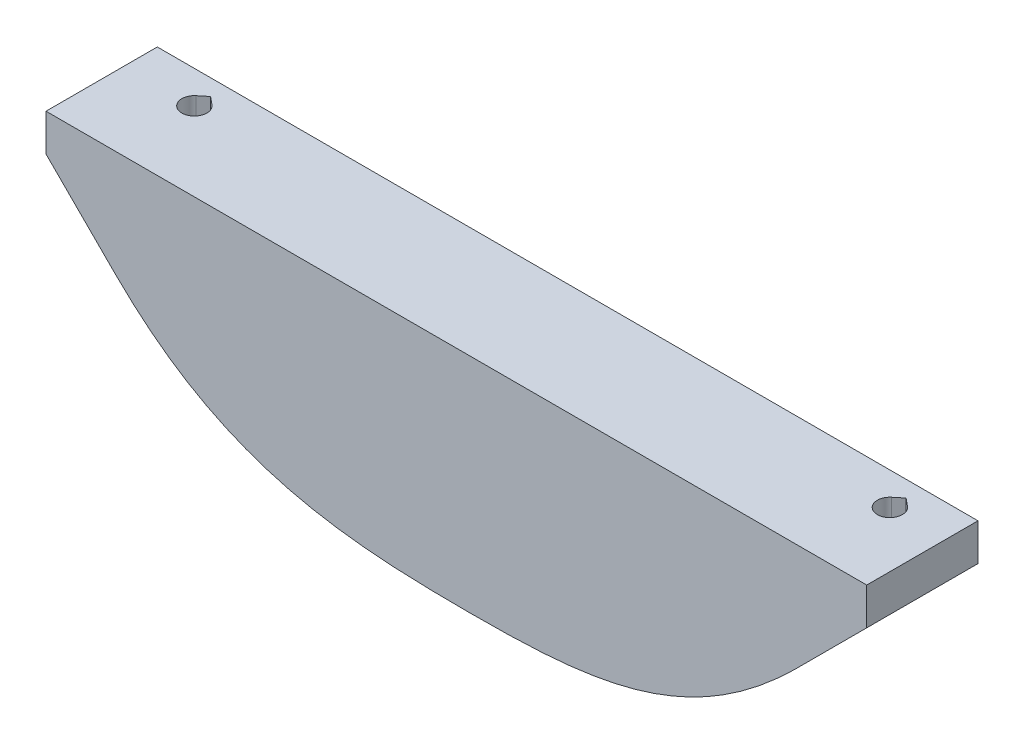
ISO-10303-21;
HEADER;
FILE_DESCRIPTION(('STEP AP214'),'2;1');
FILE_NAME('part.step','',(''),(''),'','','');
FILE_SCHEMA(('AUTOMOTIVE_DESIGN { 1 0 10303 214 1 1 1 1 }'));
ENDSEC;
DATA;
#1=APPLICATION_CONTEXT('core data for automotive mechanical design processes');
#2=APPLICATION_PROTOCOL_DEFINITION('international standard','automotive_design',2000,#1);
#3=PRODUCT_CONTEXT('',#1,'mechanical');
#4=PRODUCT('Part','Part','',(#3));
#5=PRODUCT_RELATED_PRODUCT_CATEGORY('part','',(#4));
#6=PRODUCT_DEFINITION_FORMATION('','',#4);
#7=PRODUCT_DEFINITION_CONTEXT('part definition',#1,'design');
#8=PRODUCT_DEFINITION('design','',#6,#7);
#9=PRODUCT_DEFINITION_SHAPE('','',#8);
#10=(LENGTH_UNIT() NAMED_UNIT(*) SI_UNIT(.MILLI.,.METRE.));
#11=(NAMED_UNIT(*) PLANE_ANGLE_UNIT() SI_UNIT($,.RADIAN.));
#12=(NAMED_UNIT(*) SI_UNIT($,.STERADIAN.) SOLID_ANGLE_UNIT());
#13=UNCERTAINTY_MEASURE_WITH_UNIT(LENGTH_MEASURE(1.E-05),#10,'distance_accuracy_value','');
#14=(GEOMETRIC_REPRESENTATION_CONTEXT(3) GLOBAL_UNCERTAINTY_ASSIGNED_CONTEXT((#13)) GLOBAL_UNIT_ASSIGNED_CONTEXT((#10,
#11,#12)) REPRESENTATION_CONTEXT('',''));
#15=CARTESIAN_POINT('',(0.,0.,0.));
#16=DIRECTION('',(0.,0.,1.));
#17=DIRECTION('',(1.,0.,0.));
#18=AXIS2_PLACEMENT_3D('',#15,#16,#17);
#19=CARTESIAN_POINT('',(82.5,-64.,-8.5));
#20=DIRECTION('',(0.,1.,0.));
#21=DIRECTION('',(0.,0.,1.));
#22=AXIS2_PLACEMENT_3D('',#19,#20,#21);
#23=CYLINDRICAL_SURFACE('',#22,1.35000000000001);
#24=DIRECTION('',(0.,1.,0.));
#25=VECTOR('',#24,1.);
#26=CARTESIAN_POINT('',(81.6409734983062,-64.,-9.54142857142858));
#27=LINE('',#26,#25);
#28=CARTESIAN_POINT('',(81.6409734983062,-43.,-9.54142857142858));
#29=VERTEX_POINT('',#28);
#30=CARTESIAN_POINT('',(81.6409734983062,-40.,-9.54142857142858));
#31=VERTEX_POINT('',#30);
#32=EDGE_CURVE('E152',#29,#31,#27,.T.);
#33=ORIENTED_EDGE('',*,*,#32,.T.);
#34=CARTESIAN_POINT('',(82.5,-40.,-8.5));
#35=DIRECTION('',(0.,1.,0.));
#36=DIRECTION('',(0.,0.,1.));
#37=AXIS2_PLACEMENT_3D('',#34,#35,#36);
#38=CIRCLE('',#37,1.35000000000001);
#39=CARTESIAN_POINT('',(83.3590265016938,-40.,-9.54142857142858));
#40=VERTEX_POINT('',#39);
#41=EDGE_CURVE('E162',#31,#40,#38,.T.);
#42=ORIENTED_EDGE('',*,*,#41,.T.);
#43=DIRECTION('',(0.,1.,0.));
#44=VECTOR('',#43,1.);
#45=CARTESIAN_POINT('',(83.3590265016938,-64.,-9.54142857142858));
#46=LINE('',#45,#44);
#47=CARTESIAN_POINT('',(83.3590265016938,-43.,-9.54142857142858));
#48=VERTEX_POINT('',#47);
#49=EDGE_CURVE('E165',#48,#40,#46,.T.);
#50=ORIENTED_EDGE('',*,*,#49,.F.);
#51=CARTESIAN_POINT('',(82.5,-43.,-8.5));
#52=DIRECTION('',(0.,1.,0.));
#53=DIRECTION('',(0.,0.,1.));
#54=AXIS2_PLACEMENT_3D('',#51,#52,#53);
#55=CIRCLE('',#54,1.35000000000001);
#56=EDGE_CURVE('E164',#48,#29,#55,.F.);
#57=ORIENTED_EDGE('',*,*,#56,.T.);
#58=EDGE_LOOP('',(#33,#42,#50,#57));
#59=FACE_BOUND('',#58,.T.);
#60=ADVANCED_FACE('F43',(#59),#23,.F.);
#61=CARTESIAN_POINT('',(7.5,-64.,-8.5));
#62=DIRECTION('',(0.,1.,0.));
#63=DIRECTION('',(0.,0.,1.));
#64=AXIS2_PLACEMENT_3D('',#61,#62,#63);
#65=CYLINDRICAL_SURFACE('',#64,1.35);
#66=DIRECTION('',(0.,1.,0.));
#67=VECTOR('',#66,1.);
#68=CARTESIAN_POINT('',(6.64097349830623,-64.,-9.54142857142858));
#69=LINE('',#68,#67);
#70=CARTESIAN_POINT('',(6.64097349830623,-43.,-9.54142857142858));
#71=VERTEX_POINT('',#70);
#72=CARTESIAN_POINT('',(6.64097349830623,-40.,-9.54142857142858));
#73=VERTEX_POINT('',#72);
#74=EDGE_CURVE('E273',#71,#73,#69,.T.);
#75=ORIENTED_EDGE('',*,*,#74,.T.);
#76=CARTESIAN_POINT('',(7.5,-40.,-8.5));
#77=DIRECTION('',(0.,1.,0.));
#78=DIRECTION('',(0.,0.,1.));
#79=AXIS2_PLACEMENT_3D('',#76,#77,#78);
#80=CIRCLE('',#79,1.35);
#81=CARTESIAN_POINT('',(8.35902650169377,-40.,-9.54142857142857));
#82=VERTEX_POINT('',#81);
#83=EDGE_CURVE('E168',#73,#82,#80,.T.);
#84=ORIENTED_EDGE('',*,*,#83,.T.);
#85=DIRECTION('',(0.,1.,0.));
#86=VECTOR('',#85,1.);
#87=CARTESIAN_POINT('',(8.35902650169377,-64.,-9.54142857142857));
#88=LINE('',#87,#86);
#89=CARTESIAN_POINT('',(8.35902650169377,-43.,-9.54142857142857));
#90=VERTEX_POINT('',#89);
#91=EDGE_CURVE('E275',#90,#82,#88,.T.);
#92=ORIENTED_EDGE('',*,*,#91,.F.);
#93=CARTESIAN_POINT('',(7.5,-43.,-8.5));
#94=DIRECTION('',(0.,1.,0.));
#95=DIRECTION('',(0.,0.,1.));
#96=AXIS2_PLACEMENT_3D('',#93,#94,#95);
#97=CIRCLE('',#96,1.35);
#98=EDGE_CURVE('E280',#90,#71,#97,.F.);
#99=ORIENTED_EDGE('',*,*,#98,.T.);
#100=EDGE_LOOP('',(#75,#84,#92,#99));
#101=FACE_BOUND('',#100,.T.);
#102=ADVANCED_FACE('F294',(#101),#65,.F.);
#103=CARTESIAN_POINT('',(45.75,-64.,-12.));
#104=CARTESIAN_POINT('',(59.0199011969863,-64.,-12.));
#105=CARTESIAN_POINT('',(69.4421031795114,-63.0578968204885,-12.));
#106=CARTESIAN_POINT('',(81.,-51.4999999999998,-12.));
#107=B_SPLINE_CURVE_WITH_KNOTS('',3,(#103,#104,#105,#106),.UNSPECIFIED.,.F.,.F.,(4,4),(0.,1.),.UNSPECIFIED.);
#108=DIRECTION('',(0.,0.,1.));
#109=VECTOR('',#108,1.);
#110=SURFACE_OF_LINEAR_EXTRUSION('',#107,#109);
#111=DIRECTION('',(0.,0.,1.));
#112=VECTOR('',#111,1.);
#113=CARTESIAN_POINT('',(81.,-51.4999999999998,-12.));
#114=LINE('',#113,#112);
#115=CARTESIAN_POINT('',(81.,-51.4999999999998,-12.));
#116=VERTEX_POINT('',#115);
#117=CARTESIAN_POINT('',(81.,-51.4999999999998,-10.5));
#118=VERTEX_POINT('',#117);
#119=EDGE_CURVE('E326',#116,#118,#114,.T.);
#120=ORIENTED_EDGE('',*,*,#119,.T.);
#121=CARTESIAN_POINT('',(81.,-51.4999999999998,-10.5));
#122=CARTESIAN_POINT('',(80.8981381493243,-51.6019004563563,-10.4236028488812));
#123=CARTESIAN_POINT('',(80.7990052924902,-51.7002577847678,-10.3370636780068));
#124=CARTESIAN_POINT('',(80.6101749607675,-51.886433368408,-10.1423063659683));
#125=CARTESIAN_POINT('',(80.5205764294138,-51.9741422303385,-10.0338894466249));
#126=CARTESIAN_POINT('',(80.3768845782632,-52.1140246493418,-9.82450678986994));
#127=CARTESIAN_POINT('',(80.3194619907394,-52.1696472815226,-9.72817582438411));
#128=CARTESIAN_POINT('',(80.2164771831726,-52.2690655989393,-9.52397011733765));
#129=CARTESIAN_POINT('',(80.1708789814763,-52.312897179975,-9.41613184070211));
#130=CARTESIAN_POINT('',(80.1133211283983,-52.3680943966089,-9.24659156364402));
#131=CARTESIAN_POINT('',(80.0958721129863,-52.3848012724121,-9.18841718945097));
#132=CARTESIAN_POINT('',(80.0650863613742,-52.4142483485708,-9.07002514962394));
#133=CARTESIAN_POINT('',(80.0517474095305,-52.4269906861567,-9.00980860438293));
#134=CARTESIAN_POINT('',(80.0294871168373,-52.4482412008218,-8.88782507116085));
#135=CARTESIAN_POINT('',(80.0205656870604,-52.4567494631356,-8.8260581144168));
#136=CARTESIAN_POINT('',(80.0073554759728,-52.4693436044546,-8.70160848143647));
#137=CARTESIAN_POINT('',(80.0030658845351,-52.4734302568172,-8.63892596727929));
#138=CARTESIAN_POINT('',(79.9979128216856,-52.4783407169764,-8.46919224054547));
#139=CARTESIAN_POINT('',(80.0015531451674,-52.4748746341405,-8.36181398888557));
#140=CARTESIAN_POINT('',(80.0223662568896,-52.4550334219731,-8.14969663229081));
#141=CARTESIAN_POINT('',(80.0395365335569,-52.4386606885104,-8.04495704126337));
#142=CARTESIAN_POINT('',(80.0853560779265,-52.3948712080764,-7.84448416382857));
#143=CARTESIAN_POINT('',(80.1135852692799,-52.3678584415945,-7.74856432712599));
#144=CARTESIAN_POINT('',(80.179898565919,-52.3042208985521,-7.56362478250166));
#145=CARTESIAN_POINT('',(80.2179857925211,-52.2675930775573,-7.47460727166239));
#146=CARTESIAN_POINT('',(80.3192382718419,-52.1698825991026,-7.27038148472869));
#147=CARTESIAN_POINT('',(80.3863342449932,-52.1048843359905,-7.15899393299411));
#148=CARTESIAN_POINT('',(80.5322576332835,-51.9626934205865,-6.95273529717413));
#149=CARTESIAN_POINT('',(80.6111141343491,-51.8854705045487,-6.85790646516962));
#150=CARTESIAN_POINT('',(80.7427141126199,-51.7557765212964,-6.72041742350798));
#151=CARTESIAN_POINT('',(80.7928327934943,-51.7062137624676,-6.67235899311685));
#152=CARTESIAN_POINT('',(80.8950201330098,-51.6047808829769,-6.58201928439644));
#153=CARTESIAN_POINT('',(80.9470747967073,-51.5529269487418,-6.53970407838243));
#154=CARTESIAN_POINT('',(81.,-51.4999999999998,-6.5));
#155=B_SPLINE_CURVE_WITH_KNOTS('',3,(#121,#122,#123,#124,#125,#126,#127,#128,#129,#130,#131,
#132,#133,#134,#135,#136,#137,#138,#139,#140,#141,#142,#143,#144,#145,#146,#147,#148,#149,#150,
#151,#152,#153,#154),.UNSPECIFIED.,.F.,.F.,(4,2,2,2,2,2,2,2,2,2,2,2,2,2,2,2,4),(0.,
0.490223413225245,0.985119565019949,1.3592811926277,1.73229051769644,1.92101764586491,
2.1096428567287,2.29826427029663,2.48685268787951,2.80752519034097,3.12813818020169,
3.43759855421645,3.74715703173892,4.18091086759195,4.61575581312471,4.87146764475243,
5.12559619946991),.UNSPECIFIED.);
#156=CARTESIAN_POINT('',(81.,-51.4999999999998,-6.50000000000001));
#157=VERTEX_POINT('',#156);
#158=EDGE_CURVE('E247',#118,#157,#155,.T.);
#159=ORIENTED_EDGE('',*,*,#158,.T.);
#160=CARTESIAN_POINT('',(81.,-51.4999999999998,0.));
#161=VERTEX_POINT('',#160);
#162=EDGE_CURVE('E320',#157,#161,#114,.T.);
#163=ORIENTED_EDGE('',*,*,#162,.T.);
#164=CARTESIAN_POINT('',(45.75,-64.,0.));
#165=CARTESIAN_POINT('',(59.0199011969863,-64.,0.));
#166=CARTESIAN_POINT('',(69.4421031795114,-63.0578968204885,0.));
#167=CARTESIAN_POINT('',(81.,-51.4999999999998,0.));
#168=B_SPLINE_CURVE_WITH_KNOTS('',3,(#164,#165,#166,#167),.UNSPECIFIED.,.F.,.F.,(4,4),(0.,1.),.UNSPECIFIED.);
#169=CARTESIAN_POINT('',(45.75,-64.,0.));
#170=VERTEX_POINT('',#169);
#171=EDGE_CURVE('E366',#170,#161,#168,.T.);
#172=ORIENTED_EDGE('',*,*,#171,.F.);
#173=DIRECTION('',(0.,0.,1.));
#174=VECTOR('',#173,1.);
#175=CARTESIAN_POINT('',(45.75,-64.,-12.));
#176=LINE('',#175,#174);
#177=CARTESIAN_POINT('',(45.75,-64.,-12.));
#178=VERTEX_POINT('',#177);
#179=EDGE_CURVE('E327',#178,#170,#176,.T.);
#180=ORIENTED_EDGE('',*,*,#179,.F.);
#181=EDGE_CURVE('E196',#178,#116,#107,.T.);
#182=ORIENTED_EDGE('',*,*,#181,.T.);
#183=EDGE_LOOP('',(#120,#159,#163,#172,#180,#182));
#184=FACE_BOUND('',#183,.T.);
#185=ADVANCED_FACE('F210',(#184),#110,.T.);
#186=CARTESIAN_POINT('',(7.5,-51.4999999999999,-12.));
#187=CARTESIAN_POINT('',(19.0731812469173,-63.073181246917,-12.));
#188=CARTESIAN_POINT('',(31.7289344991981,-64.,-12.));
#189=CARTESIAN_POINT('',(45.75,-64.,-12.));
#190=B_SPLINE_CURVE_WITH_KNOTS('',3,(#186,#187,#188,#189),.UNSPECIFIED.,.F.,.F.,(4,4),(0.,1.),.UNSPECIFIED.);
#191=DIRECTION('',(0.,0.,1.));
#192=VECTOR('',#191,1.);
#193=SURFACE_OF_LINEAR_EXTRUSION('',#190,#192);
#194=DIRECTION('',(0.,0.,1.));
#195=VECTOR('',#194,1.);
#196=CARTESIAN_POINT('',(7.5,-51.4999999999999,-12.));
#197=LINE('',#196,#195);
#198=CARTESIAN_POINT('',(7.5,-51.4999999999999,-6.));
#199=VERTEX_POINT('',#198);
#200=CARTESIAN_POINT('',(7.5,-51.4999999999999,0.));
#201=VERTEX_POINT('',#200);
#202=EDGE_CURVE('E337',#199,#201,#197,.T.);
#203=ORIENTED_EDGE('',*,*,#202,.F.);
#204=CARTESIAN_POINT('',(7.5,-51.4999999999999,-6.));
#205=CARTESIAN_POINT('',(7.59165979181602,-51.5916671102849,-6.00002182225121));
#206=CARTESIAN_POINT('',(7.68371968998586,-51.6829841079566,-6.00504350850219));
#207=CARTESIAN_POINT('',(7.86814507978632,-51.8644517604298,-6.0255052724358));
#208=CARTESIAN_POINT('',(7.96051082394807,-51.9546000680645,-6.04096375156571));
#209=CARTESIAN_POINT('',(8.14565379132492,-52.1338352666923,-6.08293118887545));
#210=CARTESIAN_POINT('',(8.23842576491148,-52.2229022743857,-6.10955005685056));
#211=CARTESIAN_POINT('',(8.42247262549629,-52.3981708765312,-6.17436930999739));
#212=CARTESIAN_POINT('',(8.51374866744538,-52.4843747399536,-6.21256026923716));
#213=CARTESIAN_POINT('',(8.72766963258336,-52.6848046294476,-6.31782352965051));
#214=CARTESIAN_POINT('',(8.84922971947132,-52.7974042291345,-6.390355806112));
#215=CARTESIAN_POINT('',(9.08346479910837,-53.0121545773594,-6.56003886160259));
#216=CARTESIAN_POINT('',(9.19617064038699,-53.1143420091395,-6.65709869911205));
#217=CARTESIAN_POINT('',(9.38494271816455,-53.2839513160765,-6.85338778490265));
#218=CARTESIAN_POINT('',(9.46367450734276,-53.3541225148192,-6.9476561021416));
#219=CARTESIAN_POINT('',(9.60919932986215,-53.4830266873409,-7.15205102012642));
#220=CARTESIAN_POINT('',(9.67600182541446,-53.541768729968,-7.26216492595975));
#221=CARTESIAN_POINT('',(9.78362097902614,-53.6359535687267,-7.47680356279181));
#222=CARTESIAN_POINT('',(9.82692640456064,-53.6736613908218,-7.57907873809508));
#223=CARTESIAN_POINT('',(9.90022008612338,-53.7373027470303,-7.79178465511006));
#224=CARTESIAN_POINT('',(9.93021578995894,-53.7632428662559,-7.90221079527945));
#225=CARTESIAN_POINT('',(9.97502766360576,-53.8019423110304,-8.12898225572133));
#226=CARTESIAN_POINT('',(9.98976717426313,-53.8146350740439,-8.24535441484623));
#227=CARTESIAN_POINT('',(10.0026669845284,-53.8257456745836,-8.47968890223724));
#228=CARTESIAN_POINT('',(10.0008318675444,-53.8241674584863,-8.59765078188641));
#229=CARTESIAN_POINT('',(9.98160929384268,-53.8076053023677,-8.82112744912902));
#230=CARTESIAN_POINT('',(9.9655558305262,-53.7937712049316,-8.92684854644908));
#231=CARTESIAN_POINT('',(9.92073453427701,-53.7550417199852,-9.13341862335747));
#232=CARTESIAN_POINT('',(9.89196593496071,-53.7301456657335,-9.23426730886281));
#233=CARTESIAN_POINT('',(9.82204958418611,-53.6694145605798,-9.43248765067607));
#234=CARTESIAN_POINT('',(9.78049107706031,-53.6332158500589,-9.52960093690972));
#235=CARTESIAN_POINT('',(9.68745469339733,-53.5517904220451,-9.71482785778287));
#236=CARTESIAN_POINT('',(9.63597150330262,-53.5065588680067,-9.80293663267413));
#237=CARTESIAN_POINT('',(9.50077535721237,-53.3871211916968,-10.0058406296931));
#238=CARTESIAN_POINT('',(9.41281413901743,-53.3088946899752,-10.1154542498754));
#239=CARTESIAN_POINT('',(9.22554659885682,-53.1408180812689,-10.3141713016641));
#240=CARTESIAN_POINT('',(9.1262178303413,-53.0509449286674,-10.4032330682516));
#241=CARTESIAN_POINT('',(8.88577542750525,-52.8312466212013,-10.5879794980886));
#242=CARTESIAN_POINT('',(8.74178370017899,-52.6981012060703,-10.6759465775363));
#243=CARTESIAN_POINT('',(8.44719665427424,-52.4219421914781,-10.8194249503099));
#244=CARTESIAN_POINT('',(8.29659058060572,-52.2789122853994,-10.8748811085109));
#245=CARTESIAN_POINT('',(8.03747498084326,-52.0294318550485,-10.9440760809821));
#246=CARTESIAN_POINT('',(7.92945489589852,-51.9244343697561,-10.9652556628468));
#247=CARTESIAN_POINT('',(7.71411223883786,-51.7131133013675,-10.9931536053829));
#248=CARTESIAN_POINT('',(7.6067893816706,-51.6068015034584,-10.9999582381972));
#249=CARTESIAN_POINT('',(7.5,-51.4999999999999,-11.));
#250=B_SPLINE_CURVE_WITH_KNOTS('',3,(#204,#205,#206,#207,#208,#209,#210,#211,#212,#213,#214,
#215,#216,#217,#218,#219,#220,#221,#222,#223,#224,#225,#226,#227,#228,#229,#230,#231,#232,#233,
#234,#235,#236,#237,#238,#239,#240,#241,#242,#243,#244,#245,#246,#247,#248,#249),.UNSPECIFIED.,
.F.,.F.,(4,2,2,2,2,2,2,2,2,2,2,2,2,2,2,2,2,2,2,2,2,2,4),(0.,0.388850136486089,0.778387663858417,
1.17185505391982,1.56500280667377,2.10571307963264,2.64444723000454,3.06725643511144,
3.48972876744308,3.84015012207303,4.19037514110135,4.54235154747597,4.89423062423619,
5.2162269112512,5.53824260870188,5.871925592382,6.205787724638,6.68566387560185,7.1665045018113,
7.80789365536139,8.45036741462438,8.90607805302852,9.35904585397621),.UNSPECIFIED.);
#251=CARTESIAN_POINT('',(7.5,-51.4999999999999,-11.));
#252=VERTEX_POINT('',#251);
#253=EDGE_CURVE('E175',#199,#252,#250,.T.);
#254=ORIENTED_EDGE('',*,*,#253,.T.);
#255=CARTESIAN_POINT('',(7.5,-51.4999999999999,-12.));
#256=VERTEX_POINT('',#255);
#257=EDGE_CURVE('E330',#256,#252,#197,.T.);
#258=ORIENTED_EDGE('',*,*,#257,.F.);
#259=EDGE_CURVE('E190',#256,#178,#190,.T.);
#260=ORIENTED_EDGE('',*,*,#259,.T.);
#261=ORIENTED_EDGE('',*,*,#179,.T.);
#262=CARTESIAN_POINT('',(7.5,-51.4999999999999,0.));
#263=CARTESIAN_POINT('',(19.0731812469173,-63.073181246917,0.));
#264=CARTESIAN_POINT('',(31.7289344991981,-64.,0.));
#265=CARTESIAN_POINT('',(45.75,-64.,0.));
#266=B_SPLINE_CURVE_WITH_KNOTS('',3,(#262,#263,#264,#265),.UNSPECIFIED.,.F.,.F.,(4,4),(0.,1.),.UNSPECIFIED.);
#267=EDGE_CURVE('E361',#201,#170,#266,.T.);
#268=ORIENTED_EDGE('',*,*,#267,.F.);
#269=EDGE_LOOP('',(#203,#254,#258,#260,#261,#268));
#270=FACE_BOUND('',#269,.T.);
#271=ADVANCED_FACE('F205',(#270),#193,.T.);
#272=CARTESIAN_POINT('',(88.5,-40.,-12.));
#273=DIRECTION('',(1.,0.,0.));
#274=DIRECTION('',(0.,0.,-1.));
#275=AXIS2_PLACEMENT_3D('',#272,#273,#274);
#276=PLANE('',#275);
#277=DIRECTION('',(0.,1.,0.));
#278=VECTOR('',#277,1.);
#279=CARTESIAN_POINT('',(88.5,-40.,0.));
#280=LINE('',#279,#278);
#281=CARTESIAN_POINT('',(88.5,-44.,0.));
#282=VERTEX_POINT('',#281);
#283=CARTESIAN_POINT('',(88.5,-40.,0.));
#284=VERTEX_POINT('',#283);
#285=EDGE_CURVE('E172',#282,#284,#280,.T.);
#286=ORIENTED_EDGE('',*,*,#285,.F.);
#287=DIRECTION('',(0.,0.,1.));
#288=VECTOR('',#287,1.);
#289=CARTESIAN_POINT('',(88.5,-44.,-12.));
#290=LINE('',#289,#288);
#291=CARTESIAN_POINT('',(88.5,-44.,-12.));
#292=VERTEX_POINT('',#291);
#293=EDGE_CURVE('E329',#292,#282,#290,.T.);
#294=ORIENTED_EDGE('',*,*,#293,.F.);
#295=DIRECTION('',(0.,1.,0.));
#296=VECTOR('',#295,1.);
#297=CARTESIAN_POINT('',(88.5,-40.,-12.));
#298=LINE('',#297,#296);
#299=CARTESIAN_POINT('',(88.5,-40.,-12.));
#300=VERTEX_POINT('',#299);
#301=EDGE_CURVE('E178',#292,#300,#298,.T.);
#302=ORIENTED_EDGE('',*,*,#301,.T.);
#303=DIRECTION('',(0.,0.,1.));
#304=VECTOR('',#303,1.);
#305=CARTESIAN_POINT('',(88.5,-40.,-12.));
#306=LINE('',#305,#304);
#307=EDGE_CURVE('E342',#300,#284,#306,.T.);
#308=ORIENTED_EDGE('',*,*,#307,.T.);
#309=EDGE_LOOP('',(#286,#294,#302,#308));
#310=FACE_BOUND('',#309,.T.);
#311=ADVANCED_FACE('F45',(#310),#276,.T.);
#312=CARTESIAN_POINT('',(88.5,-44.,-12.));
#313=DIRECTION('',(0.707106781186541,-0.707106781186554,0.));
#314=DIRECTION('',(0.707106781186554,0.707106781186541,0.));
#315=AXIS2_PLACEMENT_3D('',#312,#313,#314);
#316=PLANE('',#315);
#317=ORIENTED_EDGE('',*,*,#162,.F.);
#318=CARTESIAN_POINT('',(82.5,-49.9999999999998,-8.5));
#319=DIRECTION('',(0.707106781186541,-0.707106781186554,0.));
#320=DIRECTION('',(-0.707106781186554,-0.707106781186541,0.));
#321=AXIS2_PLACEMENT_3D('',#318,#319,#320);
#322=ELLIPSE('',#321,3.5355339059327,2.5);
#323=EDGE_CURVE('E169',#157,#118,#322,.F.);
#324=ORIENTED_EDGE('',*,*,#323,.T.);
#325=ORIENTED_EDGE('',*,*,#119,.F.);
#326=DIRECTION('',(0.707106781186554,0.707106781186541,0.));
#327=VECTOR('',#326,1.);
#328=CARTESIAN_POINT('',(88.5,-44.,-12.));
#329=LINE('',#328,#327);
#330=EDGE_CURVE('E344',#116,#292,#329,.T.);
#331=ORIENTED_EDGE('',*,*,#330,.T.);
#332=ORIENTED_EDGE('',*,*,#293,.T.);
#333=DIRECTION('',(0.707106781186554,0.707106781186541,0.));
#334=VECTOR('',#333,1.);
#335=CARTESIAN_POINT('',(88.5,-44.,0.));
#336=LINE('',#335,#334);
#337=EDGE_CURVE('E182',#161,#282,#336,.T.);
#338=ORIENTED_EDGE('',*,*,#337,.F.);
#339=EDGE_LOOP('',(#317,#324,#325,#331,#332,#338));
#340=FACE_BOUND('',#339,.T.);
#341=ADVANCED_FACE('F308',(#340),#316,.T.);
#342=CARTESIAN_POINT('',(0.,-44.,-12.));
#343=DIRECTION('',(-0.707106781186543,-0.707106781186552,0.));
#344=DIRECTION('',(0.707106781186552,-0.707106781186543,0.));
#345=AXIS2_PLACEMENT_3D('',#342,#343,#344);
#346=PLANE('',#345);
#347=ORIENTED_EDGE('',*,*,#257,.T.);
#348=CARTESIAN_POINT('',(7.5,-51.4999999999999,-8.5));
#349=DIRECTION('',(-0.707106781186543,-0.707106781186552,0.));
#350=DIRECTION('',(0.707106781186552,-0.707106781186543,0.));
#351=AXIS2_PLACEMENT_3D('',#348,#349,#350);
#352=ELLIPSE('',#351,3.53553390593272,2.5);
#353=EDGE_CURVE('E256',#252,#199,#352,.F.);
#354=ORIENTED_EDGE('',*,*,#353,.T.);
#355=ORIENTED_EDGE('',*,*,#202,.T.);
#356=DIRECTION('',(0.707106781186551,-0.707106781186543,0.));
#357=VECTOR('',#356,1.);
#358=CARTESIAN_POINT('',(0.,-44.,0.));
#359=LINE('',#358,#357);
#360=CARTESIAN_POINT('',(0.,-44.,0.));
#361=VERTEX_POINT('',#360);
#362=EDGE_CURVE('E358',#361,#201,#359,.T.);
#363=ORIENTED_EDGE('',*,*,#362,.F.);
#364=DIRECTION('',(0.,0.,1.));
#365=VECTOR('',#364,1.);
#366=CARTESIAN_POINT('',(0.,-44.,-12.));
#367=LINE('',#366,#365);
#368=CARTESIAN_POINT('',(0.,-44.,-12.));
#369=VERTEX_POINT('',#368);
#370=EDGE_CURVE('E338',#369,#361,#367,.T.);
#371=ORIENTED_EDGE('',*,*,#370,.F.);
#372=DIRECTION('',(0.707106781186551,-0.707106781186543,0.));
#373=VECTOR('',#372,1.);
#374=CARTESIAN_POINT('',(0.,-44.,-12.));
#375=LINE('',#374,#373);
#376=EDGE_CURVE('E187',#369,#256,#375,.T.);
#377=ORIENTED_EDGE('',*,*,#376,.T.);
#378=EDGE_LOOP('',(#347,#354,#355,#363,#371,#377));
#379=FACE_BOUND('',#378,.T.);
#380=ADVANCED_FACE('F214',(#379),#346,.T.);
#381=CARTESIAN_POINT('',(0.,-40.,-12.));
#382=DIRECTION('',(-1.,0.,0.));
#383=DIRECTION('',(0.,-1.,0.));
#384=AXIS2_PLACEMENT_3D('',#381,#382,#383);
#385=PLANE('',#384);
#386=DIRECTION('',(0.,-1.,0.));
#387=VECTOR('',#386,1.);
#388=CARTESIAN_POINT('',(0.,-40.,0.));
#389=LINE('',#388,#387);
#390=CARTESIAN_POINT('',(0.,-40.,0.));
#391=VERTEX_POINT('',#390);
#392=EDGE_CURVE('E355',#391,#361,#389,.T.);
#393=ORIENTED_EDGE('',*,*,#392,.F.);
#394=DIRECTION('',(0.,0.,1.));
#395=VECTOR('',#394,1.);
#396=CARTESIAN_POINT('',(0.,-40.,-12.));
#397=LINE('',#396,#395);
#398=CARTESIAN_POINT('',(0.,-40.,-12.));
#399=VERTEX_POINT('',#398);
#400=EDGE_CURVE('E340',#399,#391,#397,.T.);
#401=ORIENTED_EDGE('',*,*,#400,.F.);
#402=DIRECTION('',(0.,-1.,0.));
#403=VECTOR('',#402,1.);
#404=CARTESIAN_POINT('',(0.,-40.,-12.));
#405=LINE('',#404,#403);
#406=EDGE_CURVE('E184',#399,#369,#405,.T.);
#407=ORIENTED_EDGE('',*,*,#406,.T.);
#408=ORIENTED_EDGE('',*,*,#370,.T.);
#409=EDGE_LOOP('',(#393,#401,#407,#408));
#410=FACE_BOUND('',#409,.T.);
#411=ADVANCED_FACE('F314',(#410),#385,.T.);
#412=CARTESIAN_POINT('',(15.,-40.,-12.));
#413=DIRECTION('',(0.,1.,0.));
#414=DIRECTION('',(0.,0.,1.));
#415=AXIS2_PLACEMENT_3D('',#412,#413,#414);
#416=PLANE('',#415);
#417=DIRECTION('',(-0.771428571428573,0.,0.636315927180573));
#418=VECTOR('',#417,1.);
#419=CARTESIAN_POINT('',(7.5,-40.,-10.25));
#420=LINE('',#419,#418);
#421=CARTESIAN_POINT('',(7.5,-40.,-10.25));
#422=VERTEX_POINT('',#421);
#423=EDGE_CURVE('E266',#422,#73,#420,.T.);
#424=ORIENTED_EDGE('',*,*,#423,.F.);
#425=DIRECTION('',(-0.771428571428571,0.,-0.636315927180574));
#426=VECTOR('',#425,1.);
#427=CARTESIAN_POINT('',(7.5,-40.,-10.25));
#428=LINE('',#427,#426);
#429=EDGE_CURVE('E271',#82,#422,#428,.T.);
#430=ORIENTED_EDGE('',*,*,#429,.F.);
#431=ORIENTED_EDGE('',*,*,#83,.F.);
#432=EDGE_LOOP('',(#424,#430,#431));
#433=FACE_BOUND('',#432,.T.);
#434=DIRECTION('',(-1.,0.,0.));
#435=VECTOR('',#434,1.);
#436=CARTESIAN_POINT('',(15.,-40.,0.));
#437=LINE('',#436,#435);
#438=EDGE_CURVE('E352',#284,#391,#437,.T.);
#439=ORIENTED_EDGE('',*,*,#438,.F.);
#440=ORIENTED_EDGE('',*,*,#307,.F.);
#441=DIRECTION('',(-1.,0.,0.));
#442=VECTOR('',#441,1.);
#443=CARTESIAN_POINT('',(88.5,-40.,-12.));
#444=LINE('',#443,#442);
#445=EDGE_CURVE('E181',#300,#399,#444,.T.);
#446=ORIENTED_EDGE('',*,*,#445,.T.);
#447=ORIENTED_EDGE('',*,*,#400,.T.);
#448=EDGE_LOOP('',(#439,#440,#446,#447));
#449=FACE_BOUND('',#448,.T.);
#450=DIRECTION('',(-0.771428571428574,0.,0.63631592718057));
#451=VECTOR('',#450,1.);
#452=CARTESIAN_POINT('',(82.5,-40.,-10.25));
#453=LINE('',#452,#451);
#454=CARTESIAN_POINT('',(82.5,-40.,-10.25));
#455=VERTEX_POINT('',#454);
#456=EDGE_CURVE('E149',#455,#31,#453,.T.);
#457=ORIENTED_EDGE('',*,*,#456,.F.);
#458=DIRECTION('',(-0.771428571428574,0.,-0.63631592718057));
#459=VECTOR('',#458,1.);
#460=CARTESIAN_POINT('',(82.5,-40.,-10.25));
#461=LINE('',#460,#459);
#462=EDGE_CURVE('E156',#40,#455,#461,.T.);
#463=ORIENTED_EDGE('',*,*,#462,.F.);
#464=ORIENTED_EDGE('',*,*,#41,.F.);
#465=EDGE_LOOP('',(#457,#463,#464));
#466=FACE_BOUND('',#465,.T.);
#467=ADVANCED_FACE('F167',(#433,#449,#466),#416,.T.);
#468=CARTESIAN_POINT('',(64.0170016411866,-62.0842113076831,-12.));
#469=DIRECTION('',(0.,0.,1.));
#470=DIRECTION('',(1.,0.,0.));
#471=AXIS2_PLACEMENT_3D('',#468,#469,#470);
#472=PLANE('',#471);
#473=ORIENTED_EDGE('',*,*,#301,.F.);
#474=ORIENTED_EDGE('',*,*,#330,.F.);
#475=ORIENTED_EDGE('',*,*,#181,.F.);
#476=ORIENTED_EDGE('',*,*,#259,.F.);
#477=ORIENTED_EDGE('',*,*,#376,.F.);
#478=ORIENTED_EDGE('',*,*,#406,.F.);
#479=ORIENTED_EDGE('',*,*,#445,.F.);
#480=EDGE_LOOP('',(#473,#474,#475,#476,#477,#478,#479));
#481=FACE_BOUND('',#480,.T.);
#482=ADVANCED_FACE('F302',(#481),#472,.F.);
#483=CARTESIAN_POINT('',(64.0170016411866,-62.0842113076831,0.));
#484=DIRECTION('',(0.,0.,1.));
#485=DIRECTION('',(1.,0.,0.));
#486=AXIS2_PLACEMENT_3D('',#483,#484,#485);
#487=PLANE('',#486);
#488=ORIENTED_EDGE('',*,*,#285,.T.);
#489=ORIENTED_EDGE('',*,*,#438,.T.);
#490=ORIENTED_EDGE('',*,*,#392,.T.);
#491=ORIENTED_EDGE('',*,*,#362,.T.);
#492=ORIENTED_EDGE('',*,*,#267,.T.);
#493=ORIENTED_EDGE('',*,*,#171,.T.);
#494=ORIENTED_EDGE('',*,*,#337,.T.);
#495=EDGE_LOOP('',(#488,#489,#490,#491,#492,#493,#494));
#496=FACE_BOUND('',#495,.T.);
#497=ADVANCED_FACE('F238',(#496),#487,.T.);
#498=CARTESIAN_POINT('',(15.,-43.,-12.));
#499=DIRECTION('',(0.,1.,0.));
#500=DIRECTION('',(0.,0.,1.));
#501=AXIS2_PLACEMENT_3D('',#498,#499,#500);
#502=PLANE('',#501);
#503=CARTESIAN_POINT('',(7.5,-43.,-8.5));
#504=DIRECTION('',(0.,1.,0.));
#505=DIRECTION('',(0.,0.,1.));
#506=AXIS2_PLACEMENT_3D('',#503,#504,#505);
#507=CIRCLE('',#506,2.5);
#508=CARTESIAN_POINT('',(7.5,-43.,-6.));
#509=VERTEX_POINT('',#508);
#510=EDGE_CURVE('E278',#509,#509,#507,.T.);
#511=ORIENTED_EDGE('',*,*,#510,.F.);
#512=EDGE_LOOP('',(#511));
#513=FACE_BOUND('',#512,.T.);
#514=DIRECTION('',(-0.771428571428571,0.,-0.636315927180574));
#515=VECTOR('',#514,1.);
#516=CARTESIAN_POINT('',(11.1042388044287,-43.,-7.27702927845525));
#517=LINE('',#516,#515);
#518=CARTESIAN_POINT('',(7.5,-43.,-10.25));
#519=VERTEX_POINT('',#518);
#520=EDGE_CURVE('E255',#90,#519,#517,.T.);
#521=ORIENTED_EDGE('',*,*,#520,.T.);
#522=DIRECTION('',(-0.771428571428573,0.,0.636315927180573));
#523=VECTOR('',#522,1.);
#524=CARTESIAN_POINT('',(12.8222918078162,-43.,-14.6401135786876));
#525=LINE('',#524,#523);
#526=EDGE_CURVE('E260',#519,#71,#525,.T.);
#527=ORIENTED_EDGE('',*,*,#526,.T.);
#528=ORIENTED_EDGE('',*,*,#98,.F.);
#529=EDGE_LOOP('',(#521,#527,#528));
#530=FACE_BOUND('',#529,.T.);
#531=ADVANCED_FACE('F232',(#513,#530),#502,.F.);
#532=CARTESIAN_POINT('',(7.5,-32.9289321881345,-8.5));
#533=DIRECTION('',(0.,-1.,0.));
#534=DIRECTION('',(0.,0.,-1.));
#535=AXIS2_PLACEMENT_3D('',#532,#533,#534);
#536=CYLINDRICAL_SURFACE('',#535,2.5);
#537=ORIENTED_EDGE('',*,*,#353,.F.);
#538=ORIENTED_EDGE('',*,*,#253,.F.);
#539=EDGE_LOOP('',(#537,#538));
#540=FACE_BOUND('',#539,.T.);
#541=ORIENTED_EDGE('',*,*,#510,.T.);
#542=EDGE_LOOP('',(#541));
#543=FACE_BOUND('',#542,.T.);
#544=ADVANCED_FACE('F226',(#540,#543),#536,.F.);
#545=CARTESIAN_POINT('',(15.,-43.,-12.));
#546=DIRECTION('',(0.,1.,0.));
#547=DIRECTION('',(0.,0.,1.));
#548=AXIS2_PLACEMENT_3D('',#545,#546,#547);
#549=PLANE('',#548);
#550=CARTESIAN_POINT('',(82.5,-43.,-8.5));
#551=DIRECTION('',(0.,1.,0.));
#552=DIRECTION('',(0.,0.,1.));
#553=AXIS2_PLACEMENT_3D('',#550,#551,#552);
#554=CIRCLE('',#553,2.5);
#555=CARTESIAN_POINT('',(82.5,-43.,-6.));
#556=VERTEX_POINT('',#555);
#557=EDGE_CURVE('E224',#556,#556,#554,.T.);
#558=ORIENTED_EDGE('',*,*,#557,.F.);
#559=EDGE_LOOP('',(#558));
#560=FACE_BOUND('',#559,.T.);
#561=DIRECTION('',(-0.771428571428575,0.,-0.63631592718057));
#562=VECTOR('',#561,1.);
#563=CARTESIAN_POINT('',(41.4715857432039,-43.,-44.092450779617));
#564=LINE('',#563,#562);
#565=CARTESIAN_POINT('',(82.5,-43.,-10.25));
#566=VERTEX_POINT('',#565);
#567=EDGE_CURVE('E51',#48,#566,#564,.T.);
#568=ORIENTED_EDGE('',*,*,#567,.T.);
#569=DIRECTION('',(-0.771428571428575,0.,0.63631592718057));
#570=VECTOR('',#569,1.);
#571=CARTESIAN_POINT('',(43.1896387465914,-43.,22.1753079224741));
#572=LINE('',#571,#570);
#573=EDGE_CURVE('E12',#566,#29,#572,.T.);
#574=ORIENTED_EDGE('',*,*,#573,.T.);
#575=ORIENTED_EDGE('',*,*,#56,.F.);
#576=EDGE_LOOP('',(#568,#574,#575));
#577=FACE_BOUND('',#576,.T.);
#578=ADVANCED_FACE('F231',(#560,#577),#549,.F.);
#579=CARTESIAN_POINT('',(82.5,-32.9289321881345,-8.5));
#580=DIRECTION('',(0.,-1.,0.));
#581=DIRECTION('',(0.,0.,-1.));
#582=AXIS2_PLACEMENT_3D('',#579,#580,#581);
#583=CYLINDRICAL_SURFACE('',#582,2.5);
#584=ORIENTED_EDGE('',*,*,#158,.F.);
#585=ORIENTED_EDGE('',*,*,#323,.F.);
#586=EDGE_LOOP('',(#584,#585));
#587=FACE_BOUND('',#586,.T.);
#588=ORIENTED_EDGE('',*,*,#557,.T.);
#589=EDGE_LOOP('',(#588));
#590=FACE_BOUND('',#589,.T.);
#591=ADVANCED_FACE('F240',(#587,#590),#583,.F.);
#592=CARTESIAN_POINT('',(7.5,-64.,-10.25));
#593=DIRECTION('',(-0.636315927180572,0.,-0.771428571428573));
#594=DIRECTION('',(-0.771428571428573,0.,0.636315927180573));
#595=AXIS2_PLACEMENT_3D('',#592,#593,#594);
#596=PLANE('',#595);
#597=DIRECTION('',(0.,1.,0.));
#598=VECTOR('',#597,1.);
#599=CARTESIAN_POINT('',(7.5,-64.,-10.25));
#600=LINE('',#599,#598);
#601=EDGE_CURVE('E66',#519,#422,#600,.T.);
#602=ORIENTED_EDGE('',*,*,#601,.T.);
#603=ORIENTED_EDGE('',*,*,#423,.T.);
#604=ORIENTED_EDGE('',*,*,#74,.F.);
#605=ORIENTED_EDGE('',*,*,#526,.F.);
#606=EDGE_LOOP('',(#602,#603,#604,#605));
#607=FACE_BOUND('',#606,.T.);
#608=ADVANCED_FACE('F234',(#607),#596,.F.);
#609=CARTESIAN_POINT('',(7.5,-64.,-10.25));
#610=DIRECTION('',(0.636315927180574,0.,-0.771428571428571));
#611=DIRECTION('',(-0.771428571428571,0.,-0.636315927180574));
#612=AXIS2_PLACEMENT_3D('',#609,#610,#611);
#613=PLANE('',#612);
#614=ORIENTED_EDGE('',*,*,#91,.T.);
#615=ORIENTED_EDGE('',*,*,#429,.T.);
#616=ORIENTED_EDGE('',*,*,#601,.F.);
#617=ORIENTED_EDGE('',*,*,#520,.F.);
#618=EDGE_LOOP('',(#614,#615,#616,#617));
#619=FACE_BOUND('',#618,.T.);
#620=ADVANCED_FACE('F402',(#619),#613,.F.);
#621=CARTESIAN_POINT('',(82.5,-64.,-10.25));
#622=DIRECTION('',(-0.63631592718057,0.,-0.771428571428574));
#623=DIRECTION('',(-0.771428571428575,0.,0.63631592718057));
#624=AXIS2_PLACEMENT_3D('',#621,#622,#623);
#625=PLANE('',#624);
#626=DIRECTION('',(0.,1.,0.));
#627=VECTOR('',#626,1.);
#628=CARTESIAN_POINT('',(82.5,-64.,-10.25));
#629=LINE('',#628,#627);
#630=EDGE_CURVE('E58',#566,#455,#629,.T.);
#631=ORIENTED_EDGE('',*,*,#630,.T.);
#632=ORIENTED_EDGE('',*,*,#456,.T.);
#633=ORIENTED_EDGE('',*,*,#32,.F.);
#634=ORIENTED_EDGE('',*,*,#573,.F.);
#635=EDGE_LOOP('',(#631,#632,#633,#634));
#636=FACE_BOUND('',#635,.T.);
#637=ADVANCED_FACE('F151',(#636),#625,.F.);
#638=CARTESIAN_POINT('',(82.5,-64.,-10.25));
#639=DIRECTION('',(0.63631592718057,0.,-0.771428571428574));
#640=DIRECTION('',(-0.771428571428575,0.,-0.63631592718057));
#641=AXIS2_PLACEMENT_3D('',#638,#639,#640);
#642=PLANE('',#641);
#643=ORIENTED_EDGE('',*,*,#49,.T.);
#644=ORIENTED_EDGE('',*,*,#462,.T.);
#645=ORIENTED_EDGE('',*,*,#630,.F.);
#646=ORIENTED_EDGE('',*,*,#567,.F.);
#647=EDGE_LOOP('',(#643,#644,#645,#646));
#648=FACE_BOUND('',#647,.T.);
#649=ADVANCED_FACE('F264',(#648),#642,.F.);
#650=CLOSED_SHELL('',(#60,#102,#185,#271,#311,#341,#380,#411,#467,#482,#497,#531,#544,#578,#591,
#608,#620,#637,#649));
#651=MANIFOLD_SOLID_BREP('B2',#650);
#652=ADVANCED_BREP_SHAPE_REPRESENTATION('',(#18,#651),#14);
#653=SHAPE_DEFINITION_REPRESENTATION(#9,#652);
ENDSEC;
END-ISO-10303-21;
